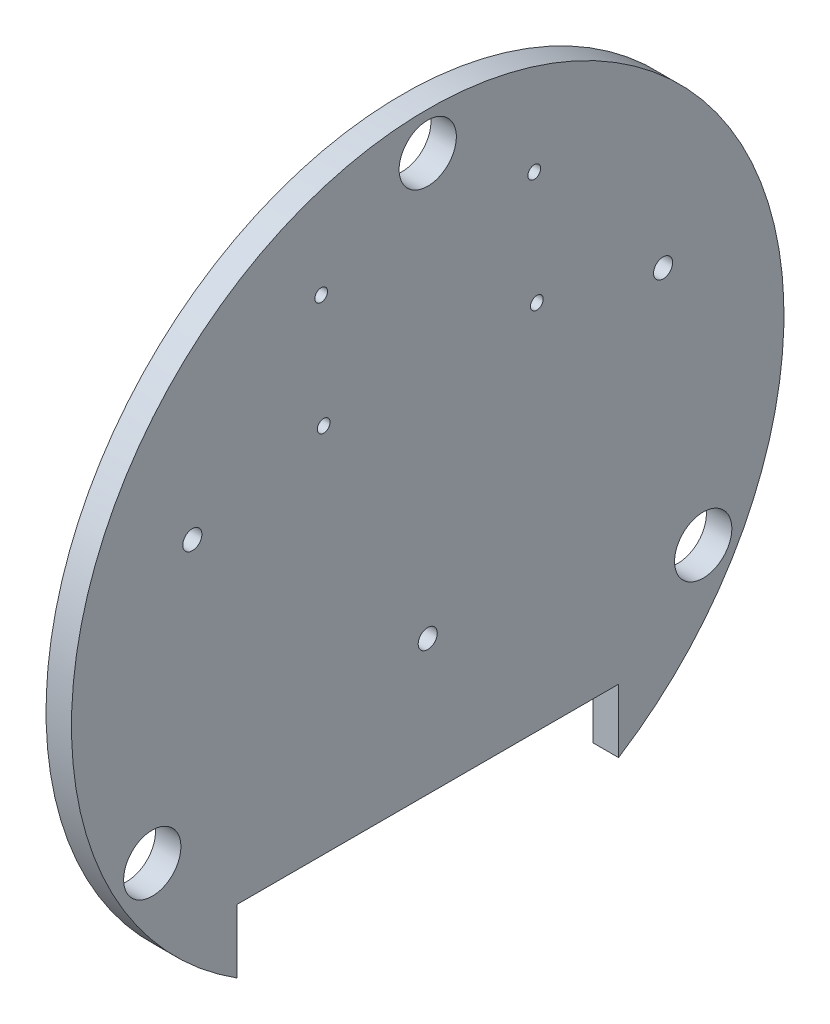
ISO-10303-21;
HEADER;
FILE_DESCRIPTION(('STEP AP214'),'2;1');
FILE_NAME('part.step','',(''),(''),'','','');
FILE_SCHEMA(('AUTOMOTIVE_DESIGN { 1 0 10303 214 1 1 1 1 }'));
ENDSEC;
DATA;
#1=APPLICATION_CONTEXT('core data for automotive mechanical design processes');
#2=APPLICATION_PROTOCOL_DEFINITION('international standard','automotive_design',2000,#1);
#3=PRODUCT_CONTEXT('',#1,'mechanical');
#4=PRODUCT('Part','Part','',(#3));
#5=PRODUCT_RELATED_PRODUCT_CATEGORY('part','',(#4));
#6=PRODUCT_DEFINITION_FORMATION('','',#4);
#7=PRODUCT_DEFINITION_CONTEXT('part definition',#1,'design');
#8=PRODUCT_DEFINITION('design','',#6,#7);
#9=PRODUCT_DEFINITION_SHAPE('','',#8);
#10=(LENGTH_UNIT() NAMED_UNIT(*) SI_UNIT(.MILLI.,.METRE.));
#11=(NAMED_UNIT(*) PLANE_ANGLE_UNIT() SI_UNIT($,.RADIAN.));
#12=(NAMED_UNIT(*) SI_UNIT($,.STERADIAN.) SOLID_ANGLE_UNIT());
#13=UNCERTAINTY_MEASURE_WITH_UNIT(LENGTH_MEASURE(1.E-05),#10,'distance_accuracy_value','');
#14=(GEOMETRIC_REPRESENTATION_CONTEXT(3) GLOBAL_UNCERTAINTY_ASSIGNED_CONTEXT((#13)) GLOBAL_UNIT_ASSIGNED_CONTEXT((#10,
#11,#12)) REPRESENTATION_CONTEXT('',''));
#15=CARTESIAN_POINT('',(0.,0.,0.));
#16=DIRECTION('',(0.,0.,1.));
#17=DIRECTION('',(1.,0.,0.));
#18=AXIS2_PLACEMENT_3D('',#15,#16,#17);
#19=CARTESIAN_POINT('',(4.,0.,0.));
#20=DIRECTION('',(-1.,0.,0.));
#21=DIRECTION('',(0.,0.,1.));
#22=AXIS2_PLACEMENT_3D('',#19,#20,#21);
#23=CYLINDRICAL_SURFACE('',#22,56.);
#24=CARTESIAN_POINT('',(4.,0.,0.));
#25=DIRECTION('',(1.,0.,0.));
#26=DIRECTION('',(0.,0.,-1.));
#27=AXIS2_PLACEMENT_3D('',#24,#25,#26);
#28=CIRCLE('',#27,56.);
#29=CARTESIAN_POINT('',(4.,-47.2863616701476,-30.));
#30=VERTEX_POINT('',#29);
#31=CARTESIAN_POINT('',(4.,-47.2863616701476,30.));
#32=VERTEX_POINT('',#31);
#33=EDGE_CURVE('E11',#30,#32,#28,.T.);
#34=ORIENTED_EDGE('',*,*,#33,.F.);
#35=DIRECTION('',(-1.,0.,0.));
#36=VECTOR('',#35,1.);
#37=CARTESIAN_POINT('',(4.,-47.2863616701476,-30.));
#38=LINE('',#37,#36);
#39=CARTESIAN_POINT('',(0.,-47.2863616701476,-30.));
#40=VERTEX_POINT('',#39);
#41=EDGE_CURVE('E56',#30,#40,#38,.T.);
#42=ORIENTED_EDGE('',*,*,#41,.T.);
#43=CARTESIAN_POINT('',(0.,0.,0.));
#44=DIRECTION('',(1.,0.,0.));
#45=DIRECTION('',(0.,0.,-1.));
#46=AXIS2_PLACEMENT_3D('',#43,#44,#45);
#47=CIRCLE('',#46,56.);
#48=CARTESIAN_POINT('',(0.,-47.2863616701476,30.));
#49=VERTEX_POINT('',#48);
#50=EDGE_CURVE('E36',#40,#49,#47,.T.);
#51=ORIENTED_EDGE('',*,*,#50,.T.);
#52=DIRECTION('',(-1.,0.,0.));
#53=VECTOR('',#52,1.);
#54=CARTESIAN_POINT('',(4.,-47.2863616701476,30.));
#55=LINE('',#54,#53);
#56=EDGE_CURVE('E47',#32,#49,#55,.T.);
#57=ORIENTED_EDGE('',*,*,#56,.F.);
#58=EDGE_LOOP('',(#34,#42,#51,#57));
#59=FACE_BOUND('',#58,.T.);
#60=ADVANCED_FACE('F33',(#59),#23,.T.);
#61=CARTESIAN_POINT('',(4.,0.,0.));
#62=DIRECTION('',(1.,0.,0.));
#63=DIRECTION('',(0.,0.,-1.));
#64=AXIS2_PLACEMENT_3D('',#61,#62,#63);
#65=PLANE('',#64);
#66=CARTESIAN_POINT('',(4.,39.0587103157266,-16.75));
#67=DIRECTION('',(1.,0.,0.));
#68=DIRECTION('',(0.,0.,-1.));
#69=AXIS2_PLACEMENT_3D('',#66,#67,#68);
#70=CIRCLE('',#69,0.999999999999998);
#71=CARTESIAN_POINT('',(4.,39.0587103157266,-17.75));
#72=VERTEX_POINT('',#71);
#73=EDGE_CURVE('E199',#72,#72,#70,.T.);
#74=ORIENTED_EDGE('',*,*,#73,.F.);
#75=EDGE_LOOP('',(#74));
#76=FACE_BOUND('',#75,.T.);
#77=CARTESIAN_POINT('',(4.,21.0632160970143,-17.1527254949618));
#78=DIRECTION('',(1.,0.,0.));
#79=DIRECTION('',(0.,0.,-1.));
#80=AXIS2_PLACEMENT_3D('',#77,#78,#79);
#81=CIRCLE('',#80,0.999999999999998);
#82=CARTESIAN_POINT('',(4.,21.0632160970143,-18.1527254949618));
#83=VERTEX_POINT('',#82);
#84=EDGE_CURVE('E204',#83,#83,#81,.T.);
#85=ORIENTED_EDGE('',*,*,#84,.F.);
#86=EDGE_LOOP('',(#85));
#87=FACE_BOUND('',#86,.T.);
#88=CARTESIAN_POINT('',(4.,21.0632160970143,16.3472745050382));
#89=DIRECTION('',(1.,0.,0.));
#90=DIRECTION('',(0.,0.,-1.));
#91=AXIS2_PLACEMENT_3D('',#88,#89,#90);
#92=CIRCLE('',#91,1.00000000000001);
#93=CARTESIAN_POINT('',(4.,21.0632160970143,15.3472745050382));
#94=VERTEX_POINT('',#93);
#95=EDGE_CURVE('E212',#94,#94,#92,.T.);
#96=ORIENTED_EDGE('',*,*,#95,.F.);
#97=EDGE_LOOP('',(#96));
#98=FACE_BOUND('',#97,.T.);
#99=CARTESIAN_POINT('',(4.,15.8843725641249,37.));
#100=DIRECTION('',(1.,0.,0.));
#101=DIRECTION('',(0.,0.,-1.));
#102=AXIS2_PLACEMENT_3D('',#99,#100,#101);
#103=CIRCLE('',#102,1.50000000000002);
#104=CARTESIAN_POINT('',(4.,15.8843725641249,35.5));
#105=VERTEX_POINT('',#104);
#106=EDGE_CURVE('E218',#105,#105,#103,.T.);
#107=ORIENTED_EDGE('',*,*,#106,.F.);
#108=EDGE_LOOP('',(#107));
#109=FACE_BOUND('',#108,.T.);
#110=CARTESIAN_POINT('',(4.,-16.0707786707343,0.));
#111=DIRECTION('',(1.,0.,0.));
#112=DIRECTION('',(0.,0.,-1.));
#113=AXIS2_PLACEMENT_3D('',#110,#111,#112);
#114=CIRCLE('',#113,1.5);
#115=CARTESIAN_POINT('',(4.,-16.0707786707343,-1.49999999999999));
#116=VERTEX_POINT('',#115);
#117=EDGE_CURVE('E224',#116,#116,#114,.T.);
#118=ORIENTED_EDGE('',*,*,#117,.F.);
#119=EDGE_LOOP('',(#118));
#120=FACE_BOUND('',#119,.T.);
#121=CARTESIAN_POINT('',(4.,15.8843725641249,-37.));
#122=DIRECTION('',(1.,0.,0.));
#123=DIRECTION('',(0.,0.,-1.));
#124=AXIS2_PLACEMENT_3D('',#121,#122,#123);
#125=CIRCLE('',#124,1.5);
#126=CARTESIAN_POINT('',(4.,15.8843725641249,-38.5));
#127=VERTEX_POINT('',#126);
#128=EDGE_CURVE('E230',#127,#127,#125,.T.);
#129=ORIENTED_EDGE('',*,*,#128,.F.);
#130=EDGE_LOOP('',(#129));
#131=FACE_BOUND('',#130,.T.);
#132=CARTESIAN_POINT('',(4.,39.0587103157266,16.75));
#133=DIRECTION('',(1.,0.,0.));
#134=DIRECTION('',(0.,0.,-1.));
#135=AXIS2_PLACEMENT_3D('',#132,#133,#134);
#136=CIRCLE('',#135,1.);
#137=CARTESIAN_POINT('',(4.,39.0587103157266,15.75));
#138=VERTEX_POINT('',#137);
#139=EDGE_CURVE('E98',#138,#138,#136,.T.);
#140=ORIENTED_EDGE('',*,*,#139,.F.);
#141=EDGE_LOOP('',(#140));
#142=FACE_BOUND('',#141,.T.);
#143=DIRECTION('',(0.,-1.,0.));
#144=VECTOR('',#143,1.);
#145=CARTESIAN_POINT('',(4.,-47.2863616701476,-30.));
#146=LINE('',#145,#144);
#147=CARTESIAN_POINT('',(4.,-37.2863616701476,-30.));
#148=VERTEX_POINT('',#147);
#149=EDGE_CURVE('E89',#148,#30,#146,.T.);
#150=ORIENTED_EDGE('',*,*,#149,.T.);
#151=ORIENTED_EDGE('',*,*,#33,.T.);
#152=DIRECTION('',(0.,1.,0.));
#153=VECTOR('',#152,1.);
#154=CARTESIAN_POINT('',(4.,-47.2863616701476,30.));
#155=LINE('',#154,#153);
#156=CARTESIAN_POINT('',(4.,-37.2863616701476,30.));
#157=VERTEX_POINT('',#156);
#158=EDGE_CURVE('E75',#32,#157,#155,.T.);
#159=ORIENTED_EDGE('',*,*,#158,.T.);
#160=DIRECTION('',(0.,0.,-1.));
#161=VECTOR('',#160,1.);
#162=CARTESIAN_POINT('',(4.,-37.2863616701476,-30.));
#163=LINE('',#162,#161);
#164=EDGE_CURVE('E86',#157,#148,#163,.T.);
#165=ORIENTED_EDGE('',*,*,#164,.T.);
#166=EDGE_LOOP('',(#150,#151,#159,#165));
#167=FACE_BOUND('',#166,.T.);
#168=CARTESIAN_POINT('',(4.,-24.9999999999981,43.3012701892251));
#169=DIRECTION('',(-1.,0.,0.));
#170=DIRECTION('',(0.,0.,1.));
#171=AXIS2_PLACEMENT_3D('',#168,#169,#170);
#172=CIRCLE('',#171,4.5);
#173=CARTESIAN_POINT('',(4.,-24.9999999999981,47.8012701892251));
#174=VERTEX_POINT('',#173);
#175=EDGE_CURVE('E109',#174,#174,#172,.T.);
#176=ORIENTED_EDGE('',*,*,#175,.T.);
#177=EDGE_LOOP('',(#176));
#178=FACE_BOUND('',#177,.T.);
#179=CARTESIAN_POINT('',(4.,-25.0000000000019,-43.3012701892187));
#180=DIRECTION('',(-1.,0.,0.));
#181=DIRECTION('',(0.,0.,1.));
#182=AXIS2_PLACEMENT_3D('',#179,#180,#181);
#183=CIRCLE('',#182,4.5);
#184=CARTESIAN_POINT('',(4.,-25.0000000000019,-38.8012701892187));
#185=VERTEX_POINT('',#184);
#186=EDGE_CURVE('E116',#185,#185,#183,.T.);
#187=ORIENTED_EDGE('',*,*,#186,.T.);
#188=EDGE_LOOP('',(#187));
#189=FACE_BOUND('',#188,.T.);
#190=CARTESIAN_POINT('',(4.,50.,0.));
#191=DIRECTION('',(-1.,0.,0.));
#192=DIRECTION('',(0.,0.,1.));
#193=AXIS2_PLACEMENT_3D('',#190,#191,#192);
#194=CIRCLE('',#193,4.5);
#195=CARTESIAN_POINT('',(4.,50.,4.5));
#196=VERTEX_POINT('',#195);
#197=EDGE_CURVE('E121',#196,#196,#194,.T.);
#198=ORIENTED_EDGE('',*,*,#197,.T.);
#199=EDGE_LOOP('',(#198));
#200=FACE_BOUND('',#199,.T.);
#201=ADVANCED_FACE('F91',(#76,#87,#98,#109,#120,#131,#142,#167,#178,#189,#200),#65,.T.);
#202=CARTESIAN_POINT('',(0.,0.,0.));
#203=DIRECTION('',(1.,0.,0.));
#204=DIRECTION('',(0.,0.,-1.));
#205=AXIS2_PLACEMENT_3D('',#202,#203,#204);
#206=PLANE('',#205);
#207=CARTESIAN_POINT('',(0.,39.0587103157266,-16.75));
#208=DIRECTION('',(1.,0.,0.));
#209=DIRECTION('',(0.,0.,-1.));
#210=AXIS2_PLACEMENT_3D('',#207,#208,#209);
#211=CIRCLE('',#210,0.999999999999998);
#212=CARTESIAN_POINT('',(0.,39.0587103157266,-17.75));
#213=VERTEX_POINT('',#212);
#214=EDGE_CURVE('E197',#213,#213,#211,.T.);
#215=ORIENTED_EDGE('',*,*,#214,.T.);
#216=EDGE_LOOP('',(#215));
#217=FACE_BOUND('',#216,.T.);
#218=CARTESIAN_POINT('',(0.,21.0632160970143,-17.1527254949618));
#219=DIRECTION('',(1.,0.,0.));
#220=DIRECTION('',(0.,0.,-1.));
#221=AXIS2_PLACEMENT_3D('',#218,#219,#220);
#222=CIRCLE('',#221,0.999999999999998);
#223=CARTESIAN_POINT('',(0.,21.0632160970143,-18.1527254949618));
#224=VERTEX_POINT('',#223);
#225=EDGE_CURVE('E200',#224,#224,#222,.T.);
#226=ORIENTED_EDGE('',*,*,#225,.T.);
#227=EDGE_LOOP('',(#226));
#228=FACE_BOUND('',#227,.T.);
#229=CARTESIAN_POINT('',(0.,21.0632160970143,16.3472745050382));
#230=DIRECTION('',(1.,0.,0.));
#231=DIRECTION('',(0.,0.,-1.));
#232=AXIS2_PLACEMENT_3D('',#229,#230,#231);
#233=CIRCLE('',#232,1.00000000000001);
#234=CARTESIAN_POINT('',(0.,21.0632160970143,15.3472745050382));
#235=VERTEX_POINT('',#234);
#236=EDGE_CURVE('E209',#235,#235,#233,.T.);
#237=ORIENTED_EDGE('',*,*,#236,.T.);
#238=EDGE_LOOP('',(#237));
#239=FACE_BOUND('',#238,.T.);
#240=CARTESIAN_POINT('',(0.,15.8843725641249,37.));
#241=DIRECTION('',(1.,0.,0.));
#242=DIRECTION('',(0.,0.,-1.));
#243=AXIS2_PLACEMENT_3D('',#240,#241,#242);
#244=CIRCLE('',#243,1.50000000000002);
#245=CARTESIAN_POINT('',(0.,15.8843725641249,35.5));
#246=VERTEX_POINT('',#245);
#247=EDGE_CURVE('E215',#246,#246,#244,.T.);
#248=ORIENTED_EDGE('',*,*,#247,.T.);
#249=EDGE_LOOP('',(#248));
#250=FACE_BOUND('',#249,.T.);
#251=CARTESIAN_POINT('',(0.,-16.0707786707343,0.));
#252=DIRECTION('',(1.,0.,0.));
#253=DIRECTION('',(0.,0.,-1.));
#254=AXIS2_PLACEMENT_3D('',#251,#252,#253);
#255=CIRCLE('',#254,1.5);
#256=CARTESIAN_POINT('',(0.,-16.0707786707343,-1.49999999999999));
#257=VERTEX_POINT('',#256);
#258=EDGE_CURVE('E221',#257,#257,#255,.T.);
#259=ORIENTED_EDGE('',*,*,#258,.T.);
#260=EDGE_LOOP('',(#259));
#261=FACE_BOUND('',#260,.T.);
#262=CARTESIAN_POINT('',(0.,15.8843725641249,-37.));
#263=DIRECTION('',(1.,0.,0.));
#264=DIRECTION('',(0.,0.,-1.));
#265=AXIS2_PLACEMENT_3D('',#262,#263,#264);
#266=CIRCLE('',#265,1.5);
#267=CARTESIAN_POINT('',(0.,15.8843725641249,-38.5));
#268=VERTEX_POINT('',#267);
#269=EDGE_CURVE('E227',#268,#268,#266,.T.);
#270=ORIENTED_EDGE('',*,*,#269,.T.);
#271=EDGE_LOOP('',(#270));
#272=FACE_BOUND('',#271,.T.);
#273=CARTESIAN_POINT('',(0.,39.0587103157266,16.75));
#274=DIRECTION('',(1.,0.,0.));
#275=DIRECTION('',(0.,0.,-1.));
#276=AXIS2_PLACEMENT_3D('',#273,#274,#275);
#277=CIRCLE('',#276,1.);
#278=CARTESIAN_POINT('',(0.,39.0587103157266,15.75));
#279=VERTEX_POINT('',#278);
#280=EDGE_CURVE('E103',#279,#279,#277,.T.);
#281=ORIENTED_EDGE('',*,*,#280,.T.);
#282=EDGE_LOOP('',(#281));
#283=FACE_BOUND('',#282,.T.);
#284=CARTESIAN_POINT('',(0.,-24.9999999999981,43.3012701892251));
#285=DIRECTION('',(-1.,0.,0.));
#286=DIRECTION('',(0.,0.,1.));
#287=AXIS2_PLACEMENT_3D('',#284,#285,#286);
#288=CIRCLE('',#287,4.5);
#289=CARTESIAN_POINT('',(0.,-24.9999999999981,47.8012701892251));
#290=VERTEX_POINT('',#289);
#291=EDGE_CURVE('E113',#290,#290,#288,.T.);
#292=ORIENTED_EDGE('',*,*,#291,.F.);
#293=EDGE_LOOP('',(#292));
#294=FACE_BOUND('',#293,.T.);
#295=CARTESIAN_POINT('',(0.,-25.0000000000019,-43.3012701892187));
#296=DIRECTION('',(-1.,0.,0.));
#297=DIRECTION('',(0.,0.,1.));
#298=AXIS2_PLACEMENT_3D('',#295,#296,#297);
#299=CIRCLE('',#298,4.5);
#300=CARTESIAN_POINT('',(0.,-25.0000000000019,-38.8012701892187));
#301=VERTEX_POINT('',#300);
#302=EDGE_CURVE('E106',#301,#301,#299,.T.);
#303=ORIENTED_EDGE('',*,*,#302,.F.);
#304=EDGE_LOOP('',(#303));
#305=FACE_BOUND('',#304,.T.);
#306=CARTESIAN_POINT('',(0.,50.,0.));
#307=DIRECTION('',(-1.,0.,0.));
#308=DIRECTION('',(0.,0.,1.));
#309=AXIS2_PLACEMENT_3D('',#306,#307,#308);
#310=CIRCLE('',#309,4.5);
#311=CARTESIAN_POINT('',(0.,50.,4.5));
#312=VERTEX_POINT('',#311);
#313=EDGE_CURVE('E112',#312,#312,#310,.T.);
#314=ORIENTED_EDGE('',*,*,#313,.F.);
#315=EDGE_LOOP('',(#314));
#316=FACE_BOUND('',#315,.T.);
#317=ORIENTED_EDGE('',*,*,#50,.F.);
#318=DIRECTION('',(0.,-1.,0.));
#319=VECTOR('',#318,1.);
#320=CARTESIAN_POINT('',(0.,-47.2863616701476,-30.));
#321=LINE('',#320,#319);
#322=CARTESIAN_POINT('',(0.,-37.2863616701476,-30.));
#323=VERTEX_POINT('',#322);
#324=EDGE_CURVE('E71',#323,#40,#321,.T.);
#325=ORIENTED_EDGE('',*,*,#324,.F.);
#326=DIRECTION('',(0.,0.,-1.));
#327=VECTOR('',#326,1.);
#328=CARTESIAN_POINT('',(0.,-37.2863616701476,-30.));
#329=LINE('',#328,#327);
#330=CARTESIAN_POINT('',(0.,-37.2863616701476,30.));
#331=VERTEX_POINT('',#330);
#332=EDGE_CURVE('E95',#331,#323,#329,.T.);
#333=ORIENTED_EDGE('',*,*,#332,.F.);
#334=DIRECTION('',(0.,1.,0.));
#335=VECTOR('',#334,1.);
#336=CARTESIAN_POINT('',(0.,-47.2863616701476,30.));
#337=LINE('',#336,#335);
#338=EDGE_CURVE('E79',#49,#331,#337,.T.);
#339=ORIENTED_EDGE('',*,*,#338,.F.);
#340=EDGE_LOOP('',(#317,#325,#333,#339));
#341=FACE_BOUND('',#340,.T.);
#342=ADVANCED_FACE('F129',(#217,#228,#239,#250,#261,#272,#283,#294,#305,#316,#341),#206,.F.);
#343=CARTESIAN_POINT('',(4.,50.,0.));
#344=DIRECTION('',(-1.,0.,0.));
#345=DIRECTION('',(0.,0.,1.));
#346=AXIS2_PLACEMENT_3D('',#343,#344,#345);
#347=CYLINDRICAL_SURFACE('',#346,4.5);
#348=ORIENTED_EDGE('',*,*,#197,.F.);
#349=EDGE_LOOP('',(#348));
#350=FACE_BOUND('',#349,.T.);
#351=ORIENTED_EDGE('',*,*,#313,.T.);
#352=EDGE_LOOP('',(#351));
#353=FACE_BOUND('',#352,.T.);
#354=ADVANCED_FACE('F127',(#350,#353),#347,.F.);
#355=CARTESIAN_POINT('',(4.,-25.0000000000019,-43.3012701892187));
#356=DIRECTION('',(-1.,0.,0.));
#357=DIRECTION('',(0.,0.,1.));
#358=AXIS2_PLACEMENT_3D('',#355,#356,#357);
#359=CYLINDRICAL_SURFACE('',#358,4.5);
#360=ORIENTED_EDGE('',*,*,#186,.F.);
#361=EDGE_LOOP('',(#360));
#362=FACE_BOUND('',#361,.T.);
#363=ORIENTED_EDGE('',*,*,#302,.T.);
#364=EDGE_LOOP('',(#363));
#365=FACE_BOUND('',#364,.T.);
#366=ADVANCED_FACE('F149',(#362,#365),#359,.F.);
#367=CARTESIAN_POINT('',(4.,-24.9999999999981,43.3012701892251));
#368=DIRECTION('',(-1.,0.,0.));
#369=DIRECTION('',(0.,0.,1.));
#370=AXIS2_PLACEMENT_3D('',#367,#368,#369);
#371=CYLINDRICAL_SURFACE('',#370,4.5);
#372=ORIENTED_EDGE('',*,*,#175,.F.);
#373=EDGE_LOOP('',(#372));
#374=FACE_BOUND('',#373,.T.);
#375=ORIENTED_EDGE('',*,*,#291,.T.);
#376=EDGE_LOOP('',(#375));
#377=FACE_BOUND('',#376,.T.);
#378=ADVANCED_FACE('F153',(#374,#377),#371,.F.);
#379=CARTESIAN_POINT('',(4.,-47.2863616701476,-30.));
#380=DIRECTION('',(0.,0.,-1.));
#381=DIRECTION('',(-1.,0.,0.));
#382=AXIS2_PLACEMENT_3D('',#379,#380,#381);
#383=PLANE('',#382);
#384=ORIENTED_EDGE('',*,*,#324,.T.);
#385=ORIENTED_EDGE('',*,*,#41,.F.);
#386=ORIENTED_EDGE('',*,*,#149,.F.);
#387=DIRECTION('',(-1.,0.,0.));
#388=VECTOR('',#387,1.);
#389=CARTESIAN_POINT('',(4.,-37.2863616701476,-30.));
#390=LINE('',#389,#388);
#391=EDGE_CURVE('E83',#148,#323,#390,.T.);
#392=ORIENTED_EDGE('',*,*,#391,.T.);
#393=EDGE_LOOP('',(#384,#385,#386,#392));
#394=FACE_BOUND('',#393,.T.);
#395=ADVANCED_FACE('F157',(#394),#383,.F.);
#396=CARTESIAN_POINT('',(4.,-37.2863616701476,-30.));
#397=DIRECTION('',(0.,1.,0.));
#398=DIRECTION('',(0.,0.,1.));
#399=AXIS2_PLACEMENT_3D('',#396,#397,#398);
#400=PLANE('',#399);
#401=ORIENTED_EDGE('',*,*,#332,.T.);
#402=ORIENTED_EDGE('',*,*,#391,.F.);
#403=ORIENTED_EDGE('',*,*,#164,.F.);
#404=DIRECTION('',(-1.,0.,0.));
#405=VECTOR('',#404,1.);
#406=CARTESIAN_POINT('',(4.,-37.2863616701476,30.));
#407=LINE('',#406,#405);
#408=EDGE_CURVE('E76',#157,#331,#407,.T.);
#409=ORIENTED_EDGE('',*,*,#408,.T.);
#410=EDGE_LOOP('',(#401,#402,#403,#409));
#411=FACE_BOUND('',#410,.T.);
#412=ADVANCED_FACE('F87',(#411),#400,.F.);
#413=CARTESIAN_POINT('',(4.,-47.2863616701476,30.));
#414=DIRECTION('',(0.,0.,1.));
#415=DIRECTION('',(0.,-1.,0.));
#416=AXIS2_PLACEMENT_3D('',#413,#414,#415);
#417=PLANE('',#416);
#418=ORIENTED_EDGE('',*,*,#338,.T.);
#419=ORIENTED_EDGE('',*,*,#408,.F.);
#420=ORIENTED_EDGE('',*,*,#158,.F.);
#421=ORIENTED_EDGE('',*,*,#56,.T.);
#422=EDGE_LOOP('',(#418,#419,#420,#421));
#423=FACE_BOUND('',#422,.T.);
#424=ADVANCED_FACE('F78',(#423),#417,.F.);
#425=CARTESIAN_POINT('',(0.,39.0587103157266,16.75));
#426=DIRECTION('',(1.,0.,0.));
#427=DIRECTION('',(0.,0.,-1.));
#428=AXIS2_PLACEMENT_3D('',#425,#426,#427);
#429=CYLINDRICAL_SURFACE('',#428,1.);
#430=ORIENTED_EDGE('',*,*,#280,.F.);
#431=EDGE_LOOP('',(#430));
#432=FACE_BOUND('',#431,.T.);
#433=ORIENTED_EDGE('',*,*,#139,.T.);
#434=EDGE_LOOP('',(#433));
#435=FACE_BOUND('',#434,.T.);
#436=ADVANCED_FACE('F161',(#432,#435),#429,.F.);
#437=CARTESIAN_POINT('',(0.,15.8843725641249,-37.));
#438=DIRECTION('',(1.,0.,0.));
#439=DIRECTION('',(0.,0.,-1.));
#440=AXIS2_PLACEMENT_3D('',#437,#438,#439);
#441=CYLINDRICAL_SURFACE('',#440,1.5);
#442=ORIENTED_EDGE('',*,*,#269,.F.);
#443=EDGE_LOOP('',(#442));
#444=FACE_BOUND('',#443,.T.);
#445=ORIENTED_EDGE('',*,*,#128,.T.);
#446=EDGE_LOOP('',(#445));
#447=FACE_BOUND('',#446,.T.);
#448=ADVANCED_FACE('F168',(#444,#447),#441,.F.);
#449=CARTESIAN_POINT('',(0.,-16.0707786707343,0.));
#450=DIRECTION('',(1.,0.,0.));
#451=DIRECTION('',(0.,0.,-1.));
#452=AXIS2_PLACEMENT_3D('',#449,#450,#451);
#453=CYLINDRICAL_SURFACE('',#452,1.5);
#454=ORIENTED_EDGE('',*,*,#258,.F.);
#455=EDGE_LOOP('',(#454));
#456=FACE_BOUND('',#455,.T.);
#457=ORIENTED_EDGE('',*,*,#117,.T.);
#458=EDGE_LOOP('',(#457));
#459=FACE_BOUND('',#458,.T.);
#460=ADVANCED_FACE('F172',(#456,#459),#453,.F.);
#461=CARTESIAN_POINT('',(0.,15.8843725641249,37.));
#462=DIRECTION('',(1.,0.,0.));
#463=DIRECTION('',(0.,0.,-1.));
#464=AXIS2_PLACEMENT_3D('',#461,#462,#463);
#465=CYLINDRICAL_SURFACE('',#464,1.50000000000002);
#466=ORIENTED_EDGE('',*,*,#247,.F.);
#467=EDGE_LOOP('',(#466));
#468=FACE_BOUND('',#467,.T.);
#469=ORIENTED_EDGE('',*,*,#106,.T.);
#470=EDGE_LOOP('',(#469));
#471=FACE_BOUND('',#470,.T.);
#472=ADVANCED_FACE('F176',(#468,#471),#465,.F.);
#473=CARTESIAN_POINT('',(0.,21.0632160970143,16.3472745050382));
#474=DIRECTION('',(1.,0.,0.));
#475=DIRECTION('',(0.,0.,-1.));
#476=AXIS2_PLACEMENT_3D('',#473,#474,#475);
#477=CYLINDRICAL_SURFACE('',#476,1.00000000000001);
#478=ORIENTED_EDGE('',*,*,#236,.F.);
#479=EDGE_LOOP('',(#478));
#480=FACE_BOUND('',#479,.T.);
#481=ORIENTED_EDGE('',*,*,#95,.T.);
#482=EDGE_LOOP('',(#481));
#483=FACE_BOUND('',#482,.T.);
#484=ADVANCED_FACE('F180',(#480,#483),#477,.F.);
#485=CARTESIAN_POINT('',(0.,21.0632160970143,-17.1527254949618));
#486=DIRECTION('',(1.,0.,0.));
#487=DIRECTION('',(0.,0.,-1.));
#488=AXIS2_PLACEMENT_3D('',#485,#486,#487);
#489=CYLINDRICAL_SURFACE('',#488,0.999999999999998);
#490=ORIENTED_EDGE('',*,*,#225,.F.);
#491=EDGE_LOOP('',(#490));
#492=FACE_BOUND('',#491,.T.);
#493=ORIENTED_EDGE('',*,*,#84,.T.);
#494=EDGE_LOOP('',(#493));
#495=FACE_BOUND('',#494,.T.);
#496=ADVANCED_FACE('F184',(#492,#495),#489,.F.);
#497=CARTESIAN_POINT('',(0.,39.0587103157266,-16.75));
#498=DIRECTION('',(1.,0.,0.));
#499=DIRECTION('',(0.,0.,-1.));
#500=AXIS2_PLACEMENT_3D('',#497,#498,#499);
#501=CYLINDRICAL_SURFACE('',#500,0.999999999999998);
#502=ORIENTED_EDGE('',*,*,#214,.F.);
#503=EDGE_LOOP('',(#502));
#504=FACE_BOUND('',#503,.T.);
#505=ORIENTED_EDGE('',*,*,#73,.T.);
#506=EDGE_LOOP('',(#505));
#507=FACE_BOUND('',#506,.T.);
#508=ADVANCED_FACE('F188',(#504,#507),#501,.F.);
#509=CLOSED_SHELL('',(#60,#201,#342,#354,#366,#378,#395,#412,#424,#436,#448,#460,#472,#484,#496,#508));
#510=MANIFOLD_SOLID_BREP('B2',#509);
#511=ADVANCED_BREP_SHAPE_REPRESENTATION('',(#18,#510),#14);
#512=SHAPE_DEFINITION_REPRESENTATION(#9,#511);
ENDSEC;
END-ISO-10303-21;
